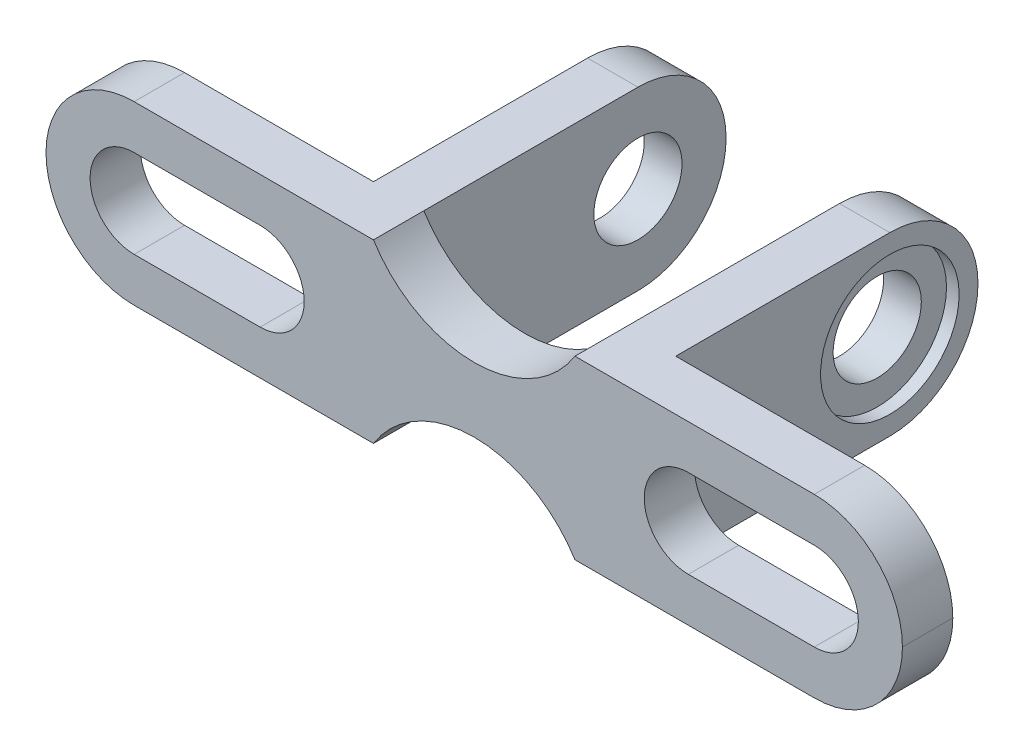
ISO-10303-21;
HEADER;
FILE_DESCRIPTION(('STEP AP214'),'2;1');
FILE_NAME('part.step','',(''),(''),'','','');
FILE_SCHEMA(('AUTOMOTIVE_DESIGN { 1 0 10303 214 1 1 1 1 }'));
ENDSEC;
DATA;
#1=APPLICATION_CONTEXT('core data for automotive mechanical design processes');
#2=APPLICATION_PROTOCOL_DEFINITION('international standard','automotive_design',2000,#1);
#3=PRODUCT_CONTEXT('',#1,'mechanical');
#4=PRODUCT('Part','Part','',(#3));
#5=PRODUCT_RELATED_PRODUCT_CATEGORY('part','',(#4));
#6=PRODUCT_DEFINITION_FORMATION('','',#4);
#7=PRODUCT_DEFINITION_CONTEXT('part definition',#1,'design');
#8=PRODUCT_DEFINITION('design','',#6,#7);
#9=PRODUCT_DEFINITION_SHAPE('','',#8);
#10=(LENGTH_UNIT() NAMED_UNIT(*) SI_UNIT(.MILLI.,.METRE.));
#11=(NAMED_UNIT(*) PLANE_ANGLE_UNIT() SI_UNIT($,.RADIAN.));
#12=(NAMED_UNIT(*) SI_UNIT($,.STERADIAN.) SOLID_ANGLE_UNIT());
#13=UNCERTAINTY_MEASURE_WITH_UNIT(LENGTH_MEASURE(1.E-05),#10,'distance_accuracy_value','');
#14=(GEOMETRIC_REPRESENTATION_CONTEXT(3) GLOBAL_UNCERTAINTY_ASSIGNED_CONTEXT((#13)) GLOBAL_UNIT_ASSIGNED_CONTEXT((#10,
#11,#12)) REPRESENTATION_CONTEXT('',''));
#15=CARTESIAN_POINT('',(0.,0.,0.));
#16=DIRECTION('',(0.,0.,1.));
#17=DIRECTION('',(1.,0.,0.));
#18=AXIS2_PLACEMENT_3D('',#15,#16,#17);
#19=CARTESIAN_POINT('',(-17.,0.,-8.5));
#20=DIRECTION('',(1.,0.,0.));
#21=DIRECTION('',(0.,0.,-1.));
#22=AXIS2_PLACEMENT_3D('',#19,#20,#21);
#23=CYLINDRICAL_SURFACE('',#22,1.75);
#24=CARTESIAN_POINT('',(-4.,0.,-8.5));
#25=DIRECTION('',(-1.,0.,0.));
#26=DIRECTION('',(0.,-1.,0.));
#27=AXIS2_PLACEMENT_3D('',#24,#25,#26);
#28=CIRCLE('',#27,1.75);
#29=CARTESIAN_POINT('',(-4.,-1.75,-8.5));
#30=VERTEX_POINT('',#29);
#31=EDGE_CURVE('E348',#30,#30,#28,.T.);
#32=ORIENTED_EDGE('',*,*,#31,.F.);
#33=EDGE_LOOP('',(#32));
#34=FACE_BOUND('',#33,.T.);
#35=CARTESIAN_POINT('',(-5.5,0.,-8.5));
#36=DIRECTION('',(-1.,0.,0.));
#37=DIRECTION('',(0.,-1.,0.));
#38=AXIS2_PLACEMENT_3D('',#35,#36,#37);
#39=CIRCLE('',#38,1.75);
#40=CARTESIAN_POINT('',(-5.5,-1.75,-8.5));
#41=VERTEX_POINT('',#40);
#42=EDGE_CURVE('E41',#41,#41,#39,.F.);
#43=ORIENTED_EDGE('',*,*,#42,.F.);
#44=EDGE_LOOP('',(#43));
#45=FACE_BOUND('',#44,.T.);
#46=ADVANCED_FACE('F37',(#34,#45),#23,.F.);
#47=CARTESIAN_POINT('',(4.,0.,-8.5));
#48=DIRECTION('',(1.,0.,0.));
#49=DIRECTION('',(0.,1.,0.));
#50=AXIS2_PLACEMENT_3D('',#47,#48,#49);
#51=CIRCLE('',#50,1.75);
#52=CARTESIAN_POINT('',(4.,1.75,-8.5));
#53=VERTEX_POINT('',#52);
#54=EDGE_CURVE('E394',#53,#53,#51,.T.);
#55=ORIENTED_EDGE('',*,*,#54,.F.);
#56=EDGE_LOOP('',(#55));
#57=FACE_BOUND('',#56,.T.);
#58=CARTESIAN_POINT('',(5.5,0.,-8.5));
#59=DIRECTION('',(1.,0.,0.));
#60=DIRECTION('',(0.,0.,-1.));
#61=AXIS2_PLACEMENT_3D('',#58,#59,#60);
#62=CIRCLE('',#61,1.75);
#63=CARTESIAN_POINT('',(5.5,0.,-10.25));
#64=VERTEX_POINT('',#63);
#65=EDGE_CURVE('E378',#64,#64,#62,.F.);
#66=ORIENTED_EDGE('',*,*,#65,.F.);
#67=EDGE_LOOP('',(#66));
#68=FACE_BOUND('',#67,.T.);
#69=ADVANCED_FACE('F527',(#57,#68),#23,.F.);
#70=CARTESIAN_POINT('',(0.,-6.,0.));
#71=DIRECTION('',(0.,0.,-1.));
#72=DIRECTION('',(-1.,0.,0.));
#73=AXIS2_PLACEMENT_3D('',#70,#71,#72);
#74=PLANE('',#73);
#75=DIRECTION('',(-1.,0.,0.));
#76=VECTOR('',#75,1.);
#77=CARTESIAN_POINT('',(-13.5,1.75,0.));
#78=LINE('',#77,#76);
#79=CARTESIAN_POINT('',(-8.5,1.75,0.));
#80=VERTEX_POINT('',#79);
#81=CARTESIAN_POINT('',(-13.5,1.75,0.));
#82=VERTEX_POINT('',#81);
#83=EDGE_CURVE('E305',#80,#82,#78,.T.);
#84=ORIENTED_EDGE('',*,*,#83,.T.);
#85=CARTESIAN_POINT('',(-13.5,0.,0.));
#86=DIRECTION('',(0.,0.,1.));
#87=DIRECTION('',(1.,0.,0.));
#88=AXIS2_PLACEMENT_3D('',#85,#86,#87);
#89=CIRCLE('',#88,1.75);
#90=CARTESIAN_POINT('',(-13.5,-1.75000000000001,0.));
#91=VERTEX_POINT('',#90);
#92=EDGE_CURVE('E301',#82,#91,#89,.T.);
#93=ORIENTED_EDGE('',*,*,#92,.T.);
#94=DIRECTION('',(1.,0.,0.));
#95=VECTOR('',#94,1.);
#96=CARTESIAN_POINT('',(-13.5,-1.75000000000001,0.));
#97=LINE('',#96,#95);
#98=CARTESIAN_POINT('',(-8.5,-1.75,0.));
#99=VERTEX_POINT('',#98);
#100=EDGE_CURVE('E315',#91,#99,#97,.T.);
#101=ORIENTED_EDGE('',*,*,#100,.T.);
#102=CARTESIAN_POINT('',(-8.5,0.,0.));
#103=DIRECTION('',(0.,0.,1.));
#104=DIRECTION('',(1.,0.,0.));
#105=AXIS2_PLACEMENT_3D('',#102,#103,#104);
#106=CIRCLE('',#105,1.75);
#107=EDGE_CURVE('E318',#99,#80,#106,.T.);
#108=ORIENTED_EDGE('',*,*,#107,.T.);
#109=EDGE_LOOP('',(#84,#93,#101,#108));
#110=FACE_BOUND('',#109,.T.);
#111=DIRECTION('',(1.,0.,0.));
#112=VECTOR('',#111,1.);
#113=CARTESIAN_POINT('',(-17.,-3.5,0.));
#114=LINE('',#113,#112);
#115=CARTESIAN_POINT('',(-13.5,-3.5,0.));
#116=VERTEX_POINT('',#115);
#117=CARTESIAN_POINT('',(-6.,-3.5,0.));
#118=VERTEX_POINT('',#117);
#119=EDGE_CURVE('E231',#116,#118,#114,.T.);
#120=ORIENTED_EDGE('',*,*,#119,.F.);
#121=CARTESIAN_POINT('',(-13.5,0.,0.));
#122=DIRECTION('',(0.,0.,-1.));
#123=DIRECTION('',(-1.,0.,0.));
#124=AXIS2_PLACEMENT_3D('',#121,#122,#123);
#125=CIRCLE('',#124,3.5);
#126=CARTESIAN_POINT('',(-17.,0.,0.));
#127=VERTEX_POINT('',#126);
#128=EDGE_CURVE('E46',#116,#127,#125,.T.);
#129=ORIENTED_EDGE('',*,*,#128,.T.);
#130=CARTESIAN_POINT('',(-13.5,0.,0.));
#131=DIRECTION('',(0.,0.,-1.));
#132=DIRECTION('',(-1.,0.,0.));
#133=AXIS2_PLACEMENT_3D('',#130,#131,#132);
#134=CIRCLE('',#133,3.5);
#135=CARTESIAN_POINT('',(-13.5,3.5,0.));
#136=VERTEX_POINT('',#135);
#137=EDGE_CURVE('E57',#127,#136,#134,.T.);
#138=ORIENTED_EDGE('',*,*,#137,.T.);
#139=DIRECTION('',(-1.,0.,0.));
#140=VECTOR('',#139,1.);
#141=CARTESIAN_POINT('',(-17.,3.5,0.));
#142=LINE('',#141,#140);
#143=CARTESIAN_POINT('',(-6.,3.5,0.));
#144=VERTEX_POINT('',#143);
#145=EDGE_CURVE('E211',#144,#136,#142,.T.);
#146=ORIENTED_EDGE('',*,*,#145,.F.);
#147=DIRECTION('',(0.,1.,0.));
#148=VECTOR('',#147,1.);
#149=CARTESIAN_POINT('',(-6.,3.5,0.));
#150=LINE('',#149,#148);
#151=EDGE_CURVE('E223',#118,#144,#150,.T.);
#152=ORIENTED_EDGE('',*,*,#151,.F.);
#153=EDGE_LOOP('',(#120,#129,#138,#146,#152));
#154=FACE_BOUND('',#153,.T.);
#155=ADVANCED_FACE('F230',(#110,#154),#74,.T.);
#156=CARTESIAN_POINT('',(0.,-6.,0.));
#157=DIRECTION('',(0.,0.,-1.));
#158=DIRECTION('',(-1.,0.,0.));
#159=AXIS2_PLACEMENT_3D('',#156,#157,#158);
#160=CIRCLE('',#159,4.7169905660283);
#161=CARTESIAN_POINT('',(-3.99999999999999,-3.5,0.));
#162=VERTEX_POINT('',#161);
#163=CARTESIAN_POINT('',(3.99999999999999,-3.5,0.));
#164=VERTEX_POINT('',#163);
#165=EDGE_CURVE('E234',#162,#164,#160,.T.);
#166=ORIENTED_EDGE('',*,*,#165,.F.);
#167=DIRECTION('',(0.,-1.,0.));
#168=VECTOR('',#167,1.);
#169=CARTESIAN_POINT('',(-4.,3.5,0.));
#170=LINE('',#169,#168);
#171=CARTESIAN_POINT('',(-4.,3.5,0.));
#172=VERTEX_POINT('',#171);
#173=EDGE_CURVE('E227',#172,#162,#170,.T.);
#174=ORIENTED_EDGE('',*,*,#173,.F.);
#175=CARTESIAN_POINT('',(0.,6.,0.));
#176=DIRECTION('',(0.,0.,-1.));
#177=DIRECTION('',(1.,0.,0.));
#178=AXIS2_PLACEMENT_3D('',#175,#176,#177);
#179=CIRCLE('',#178,4.7169905660283);
#180=CARTESIAN_POINT('',(4.,3.5,0.));
#181=VERTEX_POINT('',#180);
#182=EDGE_CURVE('E232',#181,#172,#179,.T.);
#183=ORIENTED_EDGE('',*,*,#182,.F.);
#184=DIRECTION('',(0.,1.,0.));
#185=VECTOR('',#184,1.);
#186=CARTESIAN_POINT('',(4.,3.5,0.));
#187=LINE('',#186,#185);
#188=EDGE_CURVE('E218',#164,#181,#187,.T.);
#189=ORIENTED_EDGE('',*,*,#188,.F.);
#190=EDGE_LOOP('',(#166,#174,#183,#189));
#191=FACE_BOUND('',#190,.T.);
#192=ADVANCED_FACE('F414',(#191),#74,.T.);
#193=CARTESIAN_POINT('',(0.,-6.,2.));
#194=DIRECTION('',(0.,0.,-1.));
#195=DIRECTION('',(-1.,0.,0.));
#196=AXIS2_PLACEMENT_3D('',#193,#194,#195);
#197=PLANE('',#196);
#198=CARTESIAN_POINT('',(-13.5,0.,2.));
#199=DIRECTION('',(0.,0.,1.));
#200=DIRECTION('',(1.,0.,0.));
#201=AXIS2_PLACEMENT_3D('',#198,#199,#200);
#202=CIRCLE('',#201,1.75);
#203=CARTESIAN_POINT('',(-13.5,1.75,2.));
#204=VERTEX_POINT('',#203);
#205=CARTESIAN_POINT('',(-13.5,-1.75000000000001,2.));
#206=VERTEX_POINT('',#205);
#207=EDGE_CURVE('E302',#204,#206,#202,.T.);
#208=ORIENTED_EDGE('',*,*,#207,.F.);
#209=DIRECTION('',(-1.,0.,0.));
#210=VECTOR('',#209,1.);
#211=CARTESIAN_POINT('',(-13.5,1.75,2.));
#212=LINE('',#211,#210);
#213=CARTESIAN_POINT('',(-8.5,1.75,2.));
#214=VERTEX_POINT('',#213);
#215=EDGE_CURVE('E310',#214,#204,#212,.T.);
#216=ORIENTED_EDGE('',*,*,#215,.F.);
#217=CARTESIAN_POINT('',(-8.5,0.,2.));
#218=DIRECTION('',(0.,0.,1.));
#219=DIRECTION('',(1.,0.,0.));
#220=AXIS2_PLACEMENT_3D('',#217,#218,#219);
#221=CIRCLE('',#220,1.75);
#222=CARTESIAN_POINT('',(-8.5,-1.75,2.));
#223=VERTEX_POINT('',#222);
#224=EDGE_CURVE('E307',#223,#214,#221,.T.);
#225=ORIENTED_EDGE('',*,*,#224,.F.);
#226=DIRECTION('',(1.,0.,0.));
#227=VECTOR('',#226,1.);
#228=CARTESIAN_POINT('',(-13.5,-1.75000000000001,2.));
#229=LINE('',#228,#227);
#230=EDGE_CURVE('E304',#206,#223,#229,.T.);
#231=ORIENTED_EDGE('',*,*,#230,.F.);
#232=EDGE_LOOP('',(#208,#216,#225,#231));
#233=FACE_BOUND('',#232,.T.);
#234=DIRECTION('',(1.,0.,0.));
#235=VECTOR('',#234,1.);
#236=CARTESIAN_POINT('',(3.99999999999999,-3.5,2.));
#237=LINE('',#236,#235);
#238=CARTESIAN_POINT('',(3.99999999999999,-3.5,2.));
#239=VERTEX_POINT('',#238);
#240=CARTESIAN_POINT('',(13.5,-3.5,2.));
#241=VERTEX_POINT('',#240);
#242=EDGE_CURVE('E342',#239,#241,#237,.T.);
#243=ORIENTED_EDGE('',*,*,#242,.T.);
#244=CARTESIAN_POINT('',(13.5,0.,2.));
#245=DIRECTION('',(0.,0.,-1.));
#246=DIRECTION('',(-1.,0.,0.));
#247=AXIS2_PLACEMENT_3D('',#244,#245,#246);
#248=CIRCLE('',#247,3.5);
#249=CARTESIAN_POINT('',(17.,0.,2.));
#250=VERTEX_POINT('',#249);
#251=EDGE_CURVE('E364',#241,#250,#248,.F.);
#252=ORIENTED_EDGE('',*,*,#251,.T.);
#253=CARTESIAN_POINT('',(13.5,0.,2.));
#254=DIRECTION('',(0.,0.,-1.));
#255=DIRECTION('',(-1.,0.,0.));
#256=AXIS2_PLACEMENT_3D('',#253,#254,#255);
#257=CIRCLE('',#256,3.5);
#258=CARTESIAN_POINT('',(13.5,3.5,2.));
#259=VERTEX_POINT('',#258);
#260=EDGE_CURVE('E362',#250,#259,#257,.F.);
#261=ORIENTED_EDGE('',*,*,#260,.T.);
#262=DIRECTION('',(-1.,0.,0.));
#263=VECTOR('',#262,1.);
#264=CARTESIAN_POINT('',(4.,3.5,2.));
#265=LINE('',#264,#263);
#266=CARTESIAN_POINT('',(4.,3.5,2.));
#267=VERTEX_POINT('',#266);
#268=EDGE_CURVE('E252',#259,#267,#265,.T.);
#269=ORIENTED_EDGE('',*,*,#268,.T.);
#270=CARTESIAN_POINT('',(0.,6.,2.));
#271=DIRECTION('',(0.,0.,-1.));
#272=DIRECTION('',(1.,0.,0.));
#273=AXIS2_PLACEMENT_3D('',#270,#271,#272);
#274=CIRCLE('',#273,4.7169905660283);
#275=CARTESIAN_POINT('',(-4.,3.5,2.));
#276=VERTEX_POINT('',#275);
#277=EDGE_CURVE('E333',#267,#276,#274,.T.);
#278=ORIENTED_EDGE('',*,*,#277,.T.);
#279=DIRECTION('',(-1.,0.,0.));
#280=VECTOR('',#279,1.);
#281=CARTESIAN_POINT('',(-17.,3.5,2.));
#282=LINE('',#281,#280);
#283=CARTESIAN_POINT('',(-13.5,3.5,2.));
#284=VERTEX_POINT('',#283);
#285=EDGE_CURVE('E335',#276,#284,#282,.T.);
#286=ORIENTED_EDGE('',*,*,#285,.T.);
#287=CARTESIAN_POINT('',(-13.5,0.,2.));
#288=DIRECTION('',(0.,0.,-1.));
#289=DIRECTION('',(-1.,0.,0.));
#290=AXIS2_PLACEMENT_3D('',#287,#288,#289);
#291=CIRCLE('',#290,3.5);
#292=CARTESIAN_POINT('',(-17.,0.,2.));
#293=VERTEX_POINT('',#292);
#294=EDGE_CURVE('E358',#284,#293,#291,.F.);
#295=ORIENTED_EDGE('',*,*,#294,.T.);
#296=CARTESIAN_POINT('',(-13.5,0.,2.));
#297=DIRECTION('',(0.,0.,-1.));
#298=DIRECTION('',(-1.,0.,0.));
#299=AXIS2_PLACEMENT_3D('',#296,#297,#298);
#300=CIRCLE('',#299,3.5);
#301=CARTESIAN_POINT('',(-13.5,-3.5,2.));
#302=VERTEX_POINT('',#301);
#303=EDGE_CURVE('E360',#293,#302,#300,.F.);
#304=ORIENTED_EDGE('',*,*,#303,.T.);
#305=DIRECTION('',(1.,0.,0.));
#306=VECTOR('',#305,1.);
#307=CARTESIAN_POINT('',(-17.,-3.5,2.));
#308=LINE('',#307,#306);
#309=CARTESIAN_POINT('',(-3.99999999999999,-3.5,2.));
#310=VERTEX_POINT('',#309);
#311=EDGE_CURVE('E338',#302,#310,#308,.T.);
#312=ORIENTED_EDGE('',*,*,#311,.T.);
#313=CARTESIAN_POINT('',(0.,-6.,2.));
#314=DIRECTION('',(0.,0.,-1.));
#315=DIRECTION('',(-1.,0.,0.));
#316=AXIS2_PLACEMENT_3D('',#313,#314,#315);
#317=CIRCLE('',#316,4.7169905660283);
#318=EDGE_CURVE('E340',#310,#239,#317,.T.);
#319=ORIENTED_EDGE('',*,*,#318,.T.);
#320=EDGE_LOOP('',(#243,#252,#261,#269,#278,#286,#295,#304,#312,#319));
#321=FACE_BOUND('',#320,.T.);
#322=CARTESIAN_POINT('',(13.5,0.,2.));
#323=DIRECTION('',(0.,0.,1.));
#324=DIRECTION('',(-1.,0.,0.));
#325=AXIS2_PLACEMENT_3D('',#322,#323,#324);
#326=CIRCLE('',#325,1.75);
#327=CARTESIAN_POINT('',(13.5,-1.75,2.));
#328=VERTEX_POINT('',#327);
#329=CARTESIAN_POINT('',(13.5,1.75,2.));
#330=VERTEX_POINT('',#329);
#331=EDGE_CURVE('E271',#328,#330,#326,.T.);
#332=ORIENTED_EDGE('',*,*,#331,.F.);
#333=DIRECTION('',(1.,0.,0.));
#334=VECTOR('',#333,1.);
#335=CARTESIAN_POINT('',(13.5,-1.75,2.));
#336=LINE('',#335,#334);
#337=CARTESIAN_POINT('',(8.5,-1.75,2.));
#338=VERTEX_POINT('',#337);
#339=EDGE_CURVE('E279',#338,#328,#336,.T.);
#340=ORIENTED_EDGE('',*,*,#339,.F.);
#341=CARTESIAN_POINT('',(8.5,0.,2.));
#342=DIRECTION('',(0.,0.,1.));
#343=DIRECTION('',(-1.,0.,0.));
#344=AXIS2_PLACEMENT_3D('',#341,#342,#343);
#345=CIRCLE('',#344,1.75);
#346=CARTESIAN_POINT('',(8.5,1.75,2.));
#347=VERTEX_POINT('',#346);
#348=EDGE_CURVE('E276',#347,#338,#345,.T.);
#349=ORIENTED_EDGE('',*,*,#348,.F.);
#350=DIRECTION('',(-1.,0.,0.));
#351=VECTOR('',#350,1.);
#352=CARTESIAN_POINT('',(13.5,1.75,2.));
#353=LINE('',#352,#351);
#354=EDGE_CURVE('E273',#330,#347,#353,.T.);
#355=ORIENTED_EDGE('',*,*,#354,.F.);
#356=EDGE_LOOP('',(#332,#340,#349,#355));
#357=FACE_BOUND('',#356,.T.);
#358=ADVANCED_FACE('F440',(#233,#321,#357),#197,.F.);
#359=CARTESIAN_POINT('',(13.5,0.,0.));
#360=DIRECTION('',(0.,0.,-1.));
#361=DIRECTION('',(-1.,0.,0.));
#362=AXIS2_PLACEMENT_3D('',#359,#360,#361);
#363=CIRCLE('',#362,3.5);
#364=CARTESIAN_POINT('',(13.5,3.5,0.));
#365=VERTEX_POINT('',#364);
#366=CARTESIAN_POINT('',(17.,0.,0.));
#367=VERTEX_POINT('',#366);
#368=EDGE_CURVE('E350',#365,#367,#363,.T.);
#369=ORIENTED_EDGE('',*,*,#368,.T.);
#370=CARTESIAN_POINT('',(13.5,0.,0.));
#371=DIRECTION('',(0.,0.,-1.));
#372=DIRECTION('',(-1.,0.,0.));
#373=AXIS2_PLACEMENT_3D('',#370,#371,#372);
#374=CIRCLE('',#373,3.5);
#375=CARTESIAN_POINT('',(13.5,-3.5,0.));
#376=VERTEX_POINT('',#375);
#377=EDGE_CURVE('E352',#367,#376,#374,.T.);
#378=ORIENTED_EDGE('',*,*,#377,.T.);
#379=DIRECTION('',(1.,0.,0.));
#380=VECTOR('',#379,1.);
#381=CARTESIAN_POINT('',(3.99999999999999,-3.5,0.));
#382=LINE('',#381,#380);
#383=CARTESIAN_POINT('',(6.,-3.5,0.));
#384=VERTEX_POINT('',#383);
#385=EDGE_CURVE('E243',#384,#376,#382,.T.);
#386=ORIENTED_EDGE('',*,*,#385,.F.);
#387=DIRECTION('',(0.,-1.,0.));
#388=VECTOR('',#387,1.);
#389=CARTESIAN_POINT('',(6.,3.5,0.));
#390=LINE('',#389,#388);
#391=CARTESIAN_POINT('',(6.,3.5,0.));
#392=VERTEX_POINT('',#391);
#393=EDGE_CURVE('E255',#392,#384,#390,.T.);
#394=ORIENTED_EDGE('',*,*,#393,.F.);
#395=DIRECTION('',(-1.,0.,0.));
#396=VECTOR('',#395,1.);
#397=CARTESIAN_POINT('',(4.,3.5,0.));
#398=LINE('',#397,#396);
#399=EDGE_CURVE('E237',#365,#392,#398,.T.);
#400=ORIENTED_EDGE('',*,*,#399,.F.);
#401=EDGE_LOOP('',(#369,#378,#386,#394,#400));
#402=FACE_BOUND('',#401,.T.);
#403=DIRECTION('',(1.,0.,0.));
#404=VECTOR('',#403,1.);
#405=CARTESIAN_POINT('',(13.5,-1.75,0.));
#406=LINE('',#405,#404);
#407=CARTESIAN_POINT('',(8.5,-1.75,0.));
#408=VERTEX_POINT('',#407);
#409=CARTESIAN_POINT('',(13.5,-1.75,0.));
#410=VERTEX_POINT('',#409);
#411=EDGE_CURVE('E274',#408,#410,#406,.T.);
#412=ORIENTED_EDGE('',*,*,#411,.T.);
#413=CARTESIAN_POINT('',(13.5,0.,0.));
#414=DIRECTION('',(0.,0.,1.));
#415=DIRECTION('',(-1.,0.,0.));
#416=AXIS2_PLACEMENT_3D('',#413,#414,#415);
#417=CIRCLE('',#416,1.75);
#418=CARTESIAN_POINT('',(13.5,1.75,0.));
#419=VERTEX_POINT('',#418);
#420=EDGE_CURVE('E269',#410,#419,#417,.T.);
#421=ORIENTED_EDGE('',*,*,#420,.T.);
#422=DIRECTION('',(-1.,0.,0.));
#423=VECTOR('',#422,1.);
#424=CARTESIAN_POINT('',(13.5,1.75,0.));
#425=LINE('',#424,#423);
#426=CARTESIAN_POINT('',(8.5,1.75,0.));
#427=VERTEX_POINT('',#426);
#428=EDGE_CURVE('E284',#419,#427,#425,.T.);
#429=ORIENTED_EDGE('',*,*,#428,.T.);
#430=CARTESIAN_POINT('',(8.5,0.,0.));
#431=DIRECTION('',(0.,0.,1.));
#432=DIRECTION('',(-1.,0.,0.));
#433=AXIS2_PLACEMENT_3D('',#430,#431,#432);
#434=CIRCLE('',#433,1.75);
#435=EDGE_CURVE('E287',#427,#408,#434,.T.);
#436=ORIENTED_EDGE('',*,*,#435,.T.);
#437=EDGE_LOOP('',(#412,#421,#429,#436));
#438=FACE_BOUND('',#437,.T.);
#439=ADVANCED_FACE('F488',(#402,#438),#74,.T.);
#440=CARTESIAN_POINT('',(4.,3.5,2.));
#441=DIRECTION('',(0.,-1.,0.));
#442=DIRECTION('',(1.,0.,0.));
#443=AXIS2_PLACEMENT_3D('',#440,#441,#442);
#444=PLANE('',#443);
#445=ORIENTED_EDGE('',*,*,#268,.F.);
#446=DIRECTION('',(0.,0.,-1.));
#447=VECTOR('',#446,1.);
#448=CARTESIAN_POINT('',(13.5,3.5,2.));
#449=LINE('',#448,#447);
#450=EDGE_CURVE('E366',#259,#365,#449,.T.);
#451=ORIENTED_EDGE('',*,*,#450,.T.);
#452=ORIENTED_EDGE('',*,*,#399,.T.);
#453=DIRECTION('',(0.,0.,1.));
#454=VECTOR('',#453,1.);
#455=CARTESIAN_POINT('',(6.,3.5,-12.));
#456=LINE('',#455,#454);
#457=CARTESIAN_POINT('',(6.,3.5,-8.5));
#458=VERTEX_POINT('',#457);
#459=EDGE_CURVE('E270',#458,#392,#456,.T.);
#460=ORIENTED_EDGE('',*,*,#459,.F.);
#461=DIRECTION('',(1.,0.,0.));
#462=VECTOR('',#461,1.);
#463=CARTESIAN_POINT('',(4.,3.5,-8.5));
#464=LINE('',#463,#462);
#465=CARTESIAN_POINT('',(4.,3.5,-8.5));
#466=VERTEX_POINT('',#465);
#467=EDGE_CURVE('E353',#458,#466,#464,.F.);
#468=ORIENTED_EDGE('',*,*,#467,.T.);
#469=DIRECTION('',(0.,0.,1.));
#470=VECTOR('',#469,1.);
#471=CARTESIAN_POINT('',(4.,3.5,-12.));
#472=LINE('',#471,#470);
#473=EDGE_CURVE('E267',#466,#181,#472,.T.);
#474=ORIENTED_EDGE('',*,*,#473,.T.);
#475=DIRECTION('',(0.,0.,-1.));
#476=VECTOR('',#475,1.);
#477=CARTESIAN_POINT('',(4.,3.5,2.));
#478=LINE('',#477,#476);
#479=EDGE_CURVE('E253',#267,#181,#478,.T.);
#480=ORIENTED_EDGE('',*,*,#479,.F.);
#481=EDGE_LOOP('',(#445,#451,#452,#460,#468,#474,#480));
#482=FACE_BOUND('',#481,.T.);
#483=ADVANCED_FACE('F498',(#482),#444,.F.);
#484=CARTESIAN_POINT('',(0.,6.,2.));
#485=DIRECTION('',(0.,0.,-1.));
#486=DIRECTION('',(-1.,0.,0.));
#487=AXIS2_PLACEMENT_3D('',#484,#485,#486);
#488=CYLINDRICAL_SURFACE('',#487,4.7169905660283);
#489=ORIENTED_EDGE('',*,*,#182,.T.);
#490=DIRECTION('',(0.,0.,-1.));
#491=VECTOR('',#490,1.);
#492=CARTESIAN_POINT('',(-4.,3.5,2.));
#493=LINE('',#492,#491);
#494=EDGE_CURVE('E421',#276,#172,#493,.T.);
#495=ORIENTED_EDGE('',*,*,#494,.F.);
#496=ORIENTED_EDGE('',*,*,#277,.F.);
#497=ORIENTED_EDGE('',*,*,#479,.T.);
#498=EDGE_LOOP('',(#489,#495,#496,#497));
#499=FACE_BOUND('',#498,.T.);
#500=ADVANCED_FACE('F419',(#499),#488,.F.);
#501=CARTESIAN_POINT('',(-17.,3.5,2.));
#502=DIRECTION('',(0.,-1.,0.));
#503=DIRECTION('',(0.,0.,-1.));
#504=AXIS2_PLACEMENT_3D('',#501,#502,#503);
#505=PLANE('',#504);
#506=ORIENTED_EDGE('',*,*,#145,.T.);
#507=DIRECTION('',(0.,0.,-1.));
#508=VECTOR('',#507,1.);
#509=CARTESIAN_POINT('',(-13.5,3.5,2.));
#510=LINE('',#509,#508);
#511=EDGE_CURVE('E11',#136,#284,#510,.F.);
#512=ORIENTED_EDGE('',*,*,#511,.T.);
#513=ORIENTED_EDGE('',*,*,#285,.F.);
#514=ORIENTED_EDGE('',*,*,#494,.T.);
#515=DIRECTION('',(0.,0.,1.));
#516=VECTOR('',#515,1.);
#517=CARTESIAN_POINT('',(-4.,3.5,-12.));
#518=LINE('',#517,#516);
#519=CARTESIAN_POINT('',(-4.,3.5,-8.5));
#520=VERTEX_POINT('',#519);
#521=EDGE_CURVE('E219',#520,#172,#518,.T.);
#522=ORIENTED_EDGE('',*,*,#521,.F.);
#523=DIRECTION('',(1.,0.,0.));
#524=VECTOR('',#523,1.);
#525=CARTESIAN_POINT('',(-17.,3.5,-8.5));
#526=LINE('',#525,#524);
#527=CARTESIAN_POINT('',(-6.,3.5,-8.5));
#528=VERTEX_POINT('',#527);
#529=EDGE_CURVE('E215',#520,#528,#526,.F.);
#530=ORIENTED_EDGE('',*,*,#529,.T.);
#531=DIRECTION('',(0.,0.,1.));
#532=VECTOR('',#531,1.);
#533=CARTESIAN_POINT('',(-6.,3.5,-12.));
#534=LINE('',#533,#532);
#535=EDGE_CURVE('E208',#528,#144,#534,.T.);
#536=ORIENTED_EDGE('',*,*,#535,.T.);
#537=EDGE_LOOP('',(#506,#512,#513,#514,#522,#530,#536));
#538=FACE_BOUND('',#537,.T.);
#539=ADVANCED_FACE('F210',(#538),#505,.F.);
#540=CARTESIAN_POINT('',(-17.,-3.5,2.));
#541=DIRECTION('',(0.,1.,0.));
#542=DIRECTION('',(0.,0.,1.));
#543=AXIS2_PLACEMENT_3D('',#540,#541,#542);
#544=PLANE('',#543);
#545=ORIENTED_EDGE('',*,*,#311,.F.);
#546=DIRECTION('',(0.,0.,-1.));
#547=VECTOR('',#546,1.);
#548=CARTESIAN_POINT('',(-13.5,-3.5,2.));
#549=LINE('',#548,#547);
#550=EDGE_CURVE('E368',#302,#116,#549,.T.);
#551=ORIENTED_EDGE('',*,*,#550,.T.);
#552=ORIENTED_EDGE('',*,*,#119,.T.);
#553=DIRECTION('',(0.,0.,1.));
#554=VECTOR('',#553,1.);
#555=CARTESIAN_POINT('',(-6.,-3.5,-12.));
#556=LINE('',#555,#554);
#557=CARTESIAN_POINT('',(-6.,-3.5,-8.5));
#558=VERTEX_POINT('',#557);
#559=EDGE_CURVE('E226',#558,#118,#556,.T.);
#560=ORIENTED_EDGE('',*,*,#559,.F.);
#561=DIRECTION('',(-1.,0.,0.));
#562=VECTOR('',#561,1.);
#563=CARTESIAN_POINT('',(-17.,-3.5,-8.5));
#564=LINE('',#563,#562);
#565=CARTESIAN_POINT('',(-4.,-3.5,-8.5));
#566=VERTEX_POINT('',#565);
#567=EDGE_CURVE('E449',#558,#566,#564,.F.);
#568=ORIENTED_EDGE('',*,*,#567,.T.);
#569=DIRECTION('',(0.,0.,1.));
#570=VECTOR('',#569,1.);
#571=CARTESIAN_POINT('',(-4.,-3.5,-12.));
#572=LINE('',#571,#570);
#573=EDGE_CURVE('E401',#566,#162,#572,.T.);
#574=ORIENTED_EDGE('',*,*,#573,.T.);
#575=DIRECTION('',(0.,0.,-1.));
#576=VECTOR('',#575,1.);
#577=CARTESIAN_POINT('',(-3.99999999999999,-3.5,2.));
#578=LINE('',#577,#576);
#579=EDGE_CURVE('E425',#310,#162,#578,.T.);
#580=ORIENTED_EDGE('',*,*,#579,.F.);
#581=EDGE_LOOP('',(#545,#551,#552,#560,#568,#574,#580));
#582=FACE_BOUND('',#581,.T.);
#583=ADVANCED_FACE('F446',(#582),#544,.F.);
#584=CARTESIAN_POINT('',(0.,-6.,2.));
#585=DIRECTION('',(0.,0.,-1.));
#586=DIRECTION('',(-1.,0.,0.));
#587=AXIS2_PLACEMENT_3D('',#584,#585,#586);
#588=CYLINDRICAL_SURFACE('',#587,4.7169905660283);
#589=ORIENTED_EDGE('',*,*,#165,.T.);
#590=DIRECTION('',(0.,0.,-1.));
#591=VECTOR('',#590,1.);
#592=CARTESIAN_POINT('',(3.99999999999999,-3.5,2.));
#593=LINE('',#592,#591);
#594=EDGE_CURVE('E246',#239,#164,#593,.T.);
#595=ORIENTED_EDGE('',*,*,#594,.F.);
#596=ORIENTED_EDGE('',*,*,#318,.F.);
#597=ORIENTED_EDGE('',*,*,#579,.T.);
#598=EDGE_LOOP('',(#589,#595,#596,#597));
#599=FACE_BOUND('',#598,.T.);
#600=ADVANCED_FACE('F438',(#599),#588,.F.);
#601=CARTESIAN_POINT('',(3.99999999999999,-3.5,2.));
#602=DIRECTION('',(0.,1.,0.));
#603=DIRECTION('',(-1.,0.,0.));
#604=AXIS2_PLACEMENT_3D('',#601,#602,#603);
#605=PLANE('',#604);
#606=ORIENTED_EDGE('',*,*,#385,.T.);
#607=DIRECTION('',(0.,0.,-1.));
#608=VECTOR('',#607,1.);
#609=CARTESIAN_POINT('',(13.5,-3.5,2.));
#610=LINE('',#609,#608);
#611=EDGE_CURVE('E355',#376,#241,#610,.F.);
#612=ORIENTED_EDGE('',*,*,#611,.T.);
#613=ORIENTED_EDGE('',*,*,#242,.F.);
#614=ORIENTED_EDGE('',*,*,#594,.T.);
#615=DIRECTION('',(0.,0.,1.));
#616=VECTOR('',#615,1.);
#617=CARTESIAN_POINT('',(4.,-3.5,-12.));
#618=LINE('',#617,#616);
#619=CARTESIAN_POINT('',(4.,-3.5,-8.5));
#620=VERTEX_POINT('',#619);
#621=EDGE_CURVE('E259',#620,#164,#618,.T.);
#622=ORIENTED_EDGE('',*,*,#621,.F.);
#623=DIRECTION('',(-1.,0.,0.));
#624=VECTOR('',#623,1.);
#625=CARTESIAN_POINT('',(6.,-3.5,-8.5));
#626=LINE('',#625,#624);
#627=CARTESIAN_POINT('',(6.,-3.5,-8.5));
#628=VERTEX_POINT('',#627);
#629=EDGE_CURVE('E469',#620,#628,#626,.F.);
#630=ORIENTED_EDGE('',*,*,#629,.T.);
#631=DIRECTION('',(0.,0.,1.));
#632=VECTOR('',#631,1.);
#633=CARTESIAN_POINT('',(6.,-3.5,-12.));
#634=LINE('',#633,#632);
#635=EDGE_CURVE('E266',#628,#384,#634,.T.);
#636=ORIENTED_EDGE('',*,*,#635,.T.);
#637=EDGE_LOOP('',(#606,#612,#613,#614,#622,#630,#636));
#638=FACE_BOUND('',#637,.T.);
#639=ADVANCED_FACE('F435',(#638),#605,.F.);
#640=CARTESIAN_POINT('',(-13.5,0.,2.));
#641=DIRECTION('',(0.,0.,-1.));
#642=DIRECTION('',(-1.,0.,0.));
#643=AXIS2_PLACEMENT_3D('',#640,#641,#642);
#644=CYLINDRICAL_SURFACE('',#643,1.75);
#645=ORIENTED_EDGE('',*,*,#92,.F.);
#646=DIRECTION('',(0.,0.,-1.));
#647=VECTOR('',#646,1.);
#648=CARTESIAN_POINT('',(-13.5,1.75,2.));
#649=LINE('',#648,#647);
#650=EDGE_CURVE('E312',#204,#82,#649,.T.);
#651=ORIENTED_EDGE('',*,*,#650,.F.);
#652=ORIENTED_EDGE('',*,*,#207,.T.);
#653=DIRECTION('',(0.,0.,-1.));
#654=VECTOR('',#653,1.);
#655=CARTESIAN_POINT('',(-13.5,-1.75000000000001,2.));
#656=LINE('',#655,#654);
#657=EDGE_CURVE('E329',#206,#91,#656,.T.);
#658=ORIENTED_EDGE('',*,*,#657,.T.);
#659=EDGE_LOOP('',(#645,#651,#652,#658));
#660=FACE_BOUND('',#659,.T.);
#661=ADVANCED_FACE('F579',(#660),#644,.F.);
#662=CARTESIAN_POINT('',(-13.5,-1.75000000000001,2.));
#663=DIRECTION('',(0.,1.,0.));
#664=DIRECTION('',(-1.,0.,0.));
#665=AXIS2_PLACEMENT_3D('',#662,#663,#664);
#666=PLANE('',#665);
#667=ORIENTED_EDGE('',*,*,#100,.F.);
#668=ORIENTED_EDGE('',*,*,#657,.F.);
#669=ORIENTED_EDGE('',*,*,#230,.T.);
#670=DIRECTION('',(0.,0.,-1.));
#671=VECTOR('',#670,1.);
#672=CARTESIAN_POINT('',(-8.5,-1.75,2.));
#673=LINE('',#672,#671);
#674=EDGE_CURVE('E327',#223,#99,#673,.T.);
#675=ORIENTED_EDGE('',*,*,#674,.T.);
#676=EDGE_LOOP('',(#667,#668,#669,#675));
#677=FACE_BOUND('',#676,.T.);
#678=ADVANCED_FACE('F575',(#677),#666,.T.);
#679=CARTESIAN_POINT('',(-8.5,0.,2.));
#680=DIRECTION('',(0.,0.,-1.));
#681=DIRECTION('',(-1.,0.,0.));
#682=AXIS2_PLACEMENT_3D('',#679,#680,#681);
#683=CYLINDRICAL_SURFACE('',#682,1.75);
#684=ORIENTED_EDGE('',*,*,#107,.F.);
#685=ORIENTED_EDGE('',*,*,#674,.F.);
#686=ORIENTED_EDGE('',*,*,#224,.T.);
#687=DIRECTION('',(0.,0.,-1.));
#688=VECTOR('',#687,1.);
#689=CARTESIAN_POINT('',(-8.5,1.75,2.));
#690=LINE('',#689,#688);
#691=EDGE_CURVE('E325',#214,#80,#690,.T.);
#692=ORIENTED_EDGE('',*,*,#691,.T.);
#693=EDGE_LOOP('',(#684,#685,#686,#692));
#694=FACE_BOUND('',#693,.T.);
#695=ADVANCED_FACE('F571',(#694),#683,.F.);
#696=CARTESIAN_POINT('',(-13.5,1.75,2.));
#697=DIRECTION('',(0.,-1.,0.));
#698=DIRECTION('',(1.,0.,0.));
#699=AXIS2_PLACEMENT_3D('',#696,#697,#698);
#700=PLANE('',#699);
#701=ORIENTED_EDGE('',*,*,#83,.F.);
#702=ORIENTED_EDGE('',*,*,#691,.F.);
#703=ORIENTED_EDGE('',*,*,#215,.T.);
#704=ORIENTED_EDGE('',*,*,#650,.T.);
#705=EDGE_LOOP('',(#701,#702,#703,#704));
#706=FACE_BOUND('',#705,.T.);
#707=ADVANCED_FACE('F567',(#706),#700,.T.);
#708=CARTESIAN_POINT('',(13.5,0.,2.));
#709=DIRECTION('',(0.,0.,-1.));
#710=DIRECTION('',(-1.,0.,0.));
#711=AXIS2_PLACEMENT_3D('',#708,#709,#710);
#712=CYLINDRICAL_SURFACE('',#711,1.75);
#713=ORIENTED_EDGE('',*,*,#420,.F.);
#714=DIRECTION('',(0.,0.,-1.));
#715=VECTOR('',#714,1.);
#716=CARTESIAN_POINT('',(13.5,-1.75,2.));
#717=LINE('',#716,#715);
#718=EDGE_CURVE('E281',#328,#410,#717,.T.);
#719=ORIENTED_EDGE('',*,*,#718,.F.);
#720=ORIENTED_EDGE('',*,*,#331,.T.);
#721=DIRECTION('',(0.,0.,-1.));
#722=VECTOR('',#721,1.);
#723=CARTESIAN_POINT('',(13.5,1.75,2.));
#724=LINE('',#723,#722);
#725=EDGE_CURVE('E298',#330,#419,#724,.T.);
#726=ORIENTED_EDGE('',*,*,#725,.T.);
#727=EDGE_LOOP('',(#713,#719,#720,#726));
#728=FACE_BOUND('',#727,.T.);
#729=ADVANCED_FACE('F563',(#728),#712,.F.);
#730=CARTESIAN_POINT('',(13.5,1.75,2.));
#731=DIRECTION('',(0.,-1.,0.));
#732=DIRECTION('',(1.,0.,0.));
#733=AXIS2_PLACEMENT_3D('',#730,#731,#732);
#734=PLANE('',#733);
#735=ORIENTED_EDGE('',*,*,#428,.F.);
#736=ORIENTED_EDGE('',*,*,#725,.F.);
#737=ORIENTED_EDGE('',*,*,#354,.T.);
#738=DIRECTION('',(0.,0.,-1.));
#739=VECTOR('',#738,1.);
#740=CARTESIAN_POINT('',(8.5,1.75,2.));
#741=LINE('',#740,#739);
#742=EDGE_CURVE('E296',#347,#427,#741,.T.);
#743=ORIENTED_EDGE('',*,*,#742,.T.);
#744=EDGE_LOOP('',(#735,#736,#737,#743));
#745=FACE_BOUND('',#744,.T.);
#746=ADVANCED_FACE('F559',(#745),#734,.T.);
#747=CARTESIAN_POINT('',(8.5,0.,2.));
#748=DIRECTION('',(0.,0.,-1.));
#749=DIRECTION('',(-1.,0.,0.));
#750=AXIS2_PLACEMENT_3D('',#747,#748,#749);
#751=CYLINDRICAL_SURFACE('',#750,1.75);
#752=ORIENTED_EDGE('',*,*,#435,.F.);
#753=ORIENTED_EDGE('',*,*,#742,.F.);
#754=ORIENTED_EDGE('',*,*,#348,.T.);
#755=DIRECTION('',(0.,0.,-1.));
#756=VECTOR('',#755,1.);
#757=CARTESIAN_POINT('',(8.5,-1.75,2.));
#758=LINE('',#757,#756);
#759=EDGE_CURVE('E294',#338,#408,#758,.T.);
#760=ORIENTED_EDGE('',*,*,#759,.T.);
#761=EDGE_LOOP('',(#752,#753,#754,#760));
#762=FACE_BOUND('',#761,.T.);
#763=ADVANCED_FACE('F555',(#762),#751,.F.);
#764=CARTESIAN_POINT('',(13.5,-1.75,2.));
#765=DIRECTION('',(0.,1.,0.));
#766=DIRECTION('',(-1.,0.,0.));
#767=AXIS2_PLACEMENT_3D('',#764,#765,#766);
#768=PLANE('',#767);
#769=ORIENTED_EDGE('',*,*,#411,.F.);
#770=ORIENTED_EDGE('',*,*,#759,.F.);
#771=ORIENTED_EDGE('',*,*,#339,.T.);
#772=ORIENTED_EDGE('',*,*,#718,.T.);
#773=EDGE_LOOP('',(#769,#770,#771,#772));
#774=FACE_BOUND('',#773,.T.);
#775=ADVANCED_FACE('F551',(#774),#768,.T.);
#776=CARTESIAN_POINT('',(4.,3.5,-12.));
#777=DIRECTION('',(1.,0.,0.));
#778=DIRECTION('',(0.,1.,0.));
#779=AXIS2_PLACEMENT_3D('',#776,#777,#778);
#780=PLANE('',#779);
#781=ORIENTED_EDGE('',*,*,#54,.T.);
#782=EDGE_LOOP('',(#781));
#783=FACE_BOUND('',#782,.T.);
#784=CARTESIAN_POINT('',(4.,0.,-8.5));
#785=DIRECTION('',(1.,0.,0.));
#786=DIRECTION('',(0.,1.,0.));
#787=AXIS2_PLACEMENT_3D('',#784,#785,#786);
#788=CIRCLE('',#787,3.5);
#789=CARTESIAN_POINT('',(4.,0.,-12.));
#790=VERTEX_POINT('',#789);
#791=EDGE_CURVE('E479',#466,#790,#788,.F.);
#792=ORIENTED_EDGE('',*,*,#791,.T.);
#793=CARTESIAN_POINT('',(4.,0.,-8.5));
#794=DIRECTION('',(1.,0.,0.));
#795=DIRECTION('',(0.,1.,0.));
#796=AXIS2_PLACEMENT_3D('',#793,#794,#795);
#797=CIRCLE('',#796,3.5);
#798=EDGE_CURVE('E481',#790,#620,#797,.F.);
#799=ORIENTED_EDGE('',*,*,#798,.T.);
#800=ORIENTED_EDGE('',*,*,#621,.T.);
#801=ORIENTED_EDGE('',*,*,#188,.T.);
#802=ORIENTED_EDGE('',*,*,#473,.F.);
#803=EDGE_LOOP('',(#792,#799,#800,#801,#802));
#804=FACE_BOUND('',#803,.T.);
#805=ADVANCED_FACE('F506',(#783,#804),#780,.F.);
#806=CARTESIAN_POINT('',(6.,3.5,-12.));
#807=DIRECTION('',(-1.,0.,0.));
#808=DIRECTION('',(0.,-1.,0.));
#809=AXIS2_PLACEMENT_3D('',#806,#807,#808);
#810=PLANE('',#809);
#811=CARTESIAN_POINT('',(6.,0.,-8.5));
#812=DIRECTION('',(1.,0.,0.));
#813=DIRECTION('',(0.,0.,-1.));
#814=AXIS2_PLACEMENT_3D('',#811,#812,#813);
#815=CIRCLE('',#814,2.75);
#816=CARTESIAN_POINT('',(6.,0.,-11.25));
#817=VERTEX_POINT('',#816);
#818=EDGE_CURVE('E384',#817,#817,#815,.T.);
#819=ORIENTED_EDGE('',*,*,#818,.F.);
#820=EDGE_LOOP('',(#819));
#821=FACE_BOUND('',#820,.T.);
#822=ORIENTED_EDGE('',*,*,#635,.F.);
#823=CARTESIAN_POINT('',(6.,0.,-8.5));
#824=DIRECTION('',(-1.,0.,0.));
#825=DIRECTION('',(0.,-1.,0.));
#826=AXIS2_PLACEMENT_3D('',#823,#824,#825);
#827=CIRCLE('',#826,3.5);
#828=CARTESIAN_POINT('',(6.,0.,-12.));
#829=VERTEX_POINT('',#828);
#830=EDGE_CURVE('E465',#628,#829,#827,.F.);
#831=ORIENTED_EDGE('',*,*,#830,.T.);
#832=CARTESIAN_POINT('',(6.,0.,-8.5));
#833=DIRECTION('',(-1.,0.,0.));
#834=DIRECTION('',(0.,-1.,0.));
#835=AXIS2_PLACEMENT_3D('',#832,#833,#834);
#836=CIRCLE('',#835,3.5);
#837=EDGE_CURVE('E467',#829,#458,#836,.F.);
#838=ORIENTED_EDGE('',*,*,#837,.T.);
#839=ORIENTED_EDGE('',*,*,#459,.T.);
#840=ORIENTED_EDGE('',*,*,#393,.T.);
#841=EDGE_LOOP('',(#822,#831,#838,#839,#840));
#842=FACE_BOUND('',#841,.T.);
#843=ADVANCED_FACE('F492',(#821,#842),#810,.F.);
#844=CARTESIAN_POINT('',(-6.,3.5,-12.));
#845=DIRECTION('',(1.,0.,0.));
#846=DIRECTION('',(0.,1.,0.));
#847=AXIS2_PLACEMENT_3D('',#844,#845,#846);
#848=PLANE('',#847);
#849=CARTESIAN_POINT('',(-6.,0.,-8.5));
#850=DIRECTION('',(-1.,0.,0.));
#851=DIRECTION('',(0.,-1.,0.));
#852=AXIS2_PLACEMENT_3D('',#849,#850,#851);
#853=CIRCLE('',#852,2.75);
#854=CARTESIAN_POINT('',(-6.,-2.75,-8.5));
#855=VERTEX_POINT('',#854);
#856=EDGE_CURVE('E391',#855,#855,#853,.T.);
#857=ORIENTED_EDGE('',*,*,#856,.F.);
#858=EDGE_LOOP('',(#857));
#859=FACE_BOUND('',#858,.T.);
#860=CARTESIAN_POINT('',(-6.,0.,-8.5));
#861=DIRECTION('',(1.,0.,0.));
#862=DIRECTION('',(0.,1.,0.));
#863=AXIS2_PLACEMENT_3D('',#860,#861,#862);
#864=CIRCLE('',#863,3.5);
#865=CARTESIAN_POINT('',(-6.,0.,-12.));
#866=VERTEX_POINT('',#865);
#867=EDGE_CURVE('E426',#528,#866,#864,.F.);
#868=ORIENTED_EDGE('',*,*,#867,.T.);
#869=CARTESIAN_POINT('',(-6.,0.,-8.5));
#870=DIRECTION('',(1.,0.,0.));
#871=DIRECTION('',(0.,1.,0.));
#872=AXIS2_PLACEMENT_3D('',#869,#870,#871);
#873=CIRCLE('',#872,3.5);
#874=EDGE_CURVE('E460',#866,#558,#873,.F.);
#875=ORIENTED_EDGE('',*,*,#874,.T.);
#876=ORIENTED_EDGE('',*,*,#559,.T.);
#877=ORIENTED_EDGE('',*,*,#151,.T.);
#878=ORIENTED_EDGE('',*,*,#535,.F.);
#879=EDGE_LOOP('',(#868,#875,#876,#877,#878));
#880=FACE_BOUND('',#879,.T.);
#881=ADVANCED_FACE('F224',(#859,#880),#848,.F.);
#882=CARTESIAN_POINT('',(-4.,3.5,-12.));
#883=DIRECTION('',(-1.,0.,0.));
#884=DIRECTION('',(0.,-1.,0.));
#885=AXIS2_PLACEMENT_3D('',#882,#883,#884);
#886=PLANE('',#885);
#887=ORIENTED_EDGE('',*,*,#31,.T.);
#888=EDGE_LOOP('',(#887));
#889=FACE_BOUND('',#888,.T.);
#890=ORIENTED_EDGE('',*,*,#573,.F.);
#891=CARTESIAN_POINT('',(-4.,0.,-8.5));
#892=DIRECTION('',(-1.,0.,0.));
#893=DIRECTION('',(0.,-1.,0.));
#894=AXIS2_PLACEMENT_3D('',#891,#892,#893);
#895=CIRCLE('',#894,3.5);
#896=CARTESIAN_POINT('',(-4.,0.,-12.));
#897=VERTEX_POINT('',#896);
#898=EDGE_CURVE('E450',#566,#897,#895,.F.);
#899=ORIENTED_EDGE('',*,*,#898,.T.);
#900=CARTESIAN_POINT('',(-4.,0.,-8.5));
#901=DIRECTION('',(-1.,0.,0.));
#902=DIRECTION('',(0.,-1.,0.));
#903=AXIS2_PLACEMENT_3D('',#900,#901,#902);
#904=CIRCLE('',#903,3.5);
#905=EDGE_CURVE('E409',#897,#520,#904,.F.);
#906=ORIENTED_EDGE('',*,*,#905,.T.);
#907=ORIENTED_EDGE('',*,*,#521,.T.);
#908=ORIENTED_EDGE('',*,*,#173,.T.);
#909=EDGE_LOOP('',(#890,#899,#906,#907,#908));
#910=FACE_BOUND('',#909,.T.);
#911=ADVANCED_FACE('F406',(#889,#910),#886,.F.);
#912=CARTESIAN_POINT('',(0.,0.,-8.5));
#913=DIRECTION('',(1.,0.,0.));
#914=DIRECTION('',(0.,0.,-1.));
#915=AXIS2_PLACEMENT_3D('',#912,#913,#914);
#916=CYLINDRICAL_SURFACE('',#915,3.5);
#917=ORIENTED_EDGE('',*,*,#529,.F.);
#918=ORIENTED_EDGE('',*,*,#905,.F.);
#919=DIRECTION('',(1.,0.,0.));
#920=VECTOR('',#919,1.);
#921=CARTESIAN_POINT('',(0.,0.,-12.));
#922=LINE('',#921,#920);
#923=EDGE_CURVE('E228',#866,#897,#922,.T.);
#924=ORIENTED_EDGE('',*,*,#923,.F.);
#925=ORIENTED_EDGE('',*,*,#867,.F.);
#926=EDGE_LOOP('',(#917,#918,#924,#925));
#927=FACE_BOUND('',#926,.T.);
#928=ADVANCED_FACE('F456',(#927),#916,.T.);
#929=CARTESIAN_POINT('',(0.,0.,-8.5));
#930=DIRECTION('',(-1.,0.,0.));
#931=DIRECTION('',(0.,0.,1.));
#932=AXIS2_PLACEMENT_3D('',#929,#930,#931);
#933=CYLINDRICAL_SURFACE('',#932,3.5);
#934=ORIENTED_EDGE('',*,*,#898,.F.);
#935=ORIENTED_EDGE('',*,*,#567,.F.);
#936=ORIENTED_EDGE('',*,*,#874,.F.);
#937=ORIENTED_EDGE('',*,*,#923,.T.);
#938=EDGE_LOOP('',(#934,#935,#936,#937));
#939=FACE_BOUND('',#938,.T.);
#940=ADVANCED_FACE('F459',(#939),#933,.T.);
#941=CARTESIAN_POINT('',(0.,0.,-8.5));
#942=DIRECTION('',(-1.,0.,0.));
#943=DIRECTION('',(0.,-1.,0.));
#944=AXIS2_PLACEMENT_3D('',#941,#942,#943);
#945=CYLINDRICAL_SURFACE('',#944,3.5);
#946=ORIENTED_EDGE('',*,*,#467,.F.);
#947=ORIENTED_EDGE('',*,*,#837,.F.);
#948=DIRECTION('',(1.,0.,0.));
#949=VECTOR('',#948,1.);
#950=CARTESIAN_POINT('',(6.,0.,-12.));
#951=LINE('',#950,#949);
#952=EDGE_CURVE('E396',#790,#829,#951,.T.);
#953=ORIENTED_EDGE('',*,*,#952,.F.);
#954=ORIENTED_EDGE('',*,*,#791,.F.);
#955=EDGE_LOOP('',(#946,#947,#953,#954));
#956=FACE_BOUND('',#955,.T.);
#957=ADVANCED_FACE('F502',(#956),#945,.T.);
#958=CARTESIAN_POINT('',(0.,0.,-8.5));
#959=DIRECTION('',(1.,0.,0.));
#960=DIRECTION('',(0.,1.,0.));
#961=AXIS2_PLACEMENT_3D('',#958,#959,#960);
#962=CYLINDRICAL_SURFACE('',#961,3.5);
#963=ORIENTED_EDGE('',*,*,#830,.F.);
#964=ORIENTED_EDGE('',*,*,#629,.F.);
#965=ORIENTED_EDGE('',*,*,#798,.F.);
#966=ORIENTED_EDGE('',*,*,#952,.T.);
#967=EDGE_LOOP('',(#963,#964,#965,#966));
#968=FACE_BOUND('',#967,.T.);
#969=ADVANCED_FACE('F523',(#968),#962,.T.);
#970=CARTESIAN_POINT('',(13.5,0.,2.));
#971=DIRECTION('',(0.,0.,-1.));
#972=DIRECTION('',(-1.,0.,0.));
#973=AXIS2_PLACEMENT_3D('',#970,#971,#972);
#974=CYLINDRICAL_SURFACE('',#973,3.5);
#975=ORIENTED_EDGE('',*,*,#450,.F.);
#976=ORIENTED_EDGE('',*,*,#260,.F.);
#977=DIRECTION('',(0.,0.,-1.));
#978=VECTOR('',#977,1.);
#979=CARTESIAN_POINT('',(17.,0.,2.));
#980=LINE('',#979,#978);
#981=EDGE_CURVE('E373',#367,#250,#980,.F.);
#982=ORIENTED_EDGE('',*,*,#981,.F.);
#983=ORIENTED_EDGE('',*,*,#368,.F.);
#984=EDGE_LOOP('',(#975,#976,#982,#983));
#985=FACE_BOUND('',#984,.T.);
#986=ADVANCED_FACE('F511',(#985),#974,.T.);
#987=CARTESIAN_POINT('',(13.5,0.,2.));
#988=DIRECTION('',(0.,0.,-1.));
#989=DIRECTION('',(-1.,0.,0.));
#990=AXIS2_PLACEMENT_3D('',#987,#988,#989);
#991=CYLINDRICAL_SURFACE('',#990,3.5);
#992=ORIENTED_EDGE('',*,*,#251,.F.);
#993=ORIENTED_EDGE('',*,*,#611,.F.);
#994=ORIENTED_EDGE('',*,*,#377,.F.);
#995=ORIENTED_EDGE('',*,*,#981,.T.);
#996=EDGE_LOOP('',(#992,#993,#994,#995));
#997=FACE_BOUND('',#996,.T.);
#998=ADVANCED_FACE('F514',(#997),#991,.T.);
#999=CARTESIAN_POINT('',(-13.5,0.,2.));
#1000=DIRECTION('',(0.,0.,-1.));
#1001=DIRECTION('',(-1.,0.,0.));
#1002=AXIS2_PLACEMENT_3D('',#999,#1000,#1001);
#1003=CYLINDRICAL_SURFACE('',#1002,3.5);
#1004=DIRECTION('',(0.,0.,-1.));
#1005=VECTOR('',#1004,1.);
#1006=CARTESIAN_POINT('',(-17.,0.,2.));
#1007=LINE('',#1006,#1005);
#1008=EDGE_CURVE('E376',#293,#127,#1007,.T.);
#1009=ORIENTED_EDGE('',*,*,#1008,.F.);
#1010=ORIENTED_EDGE('',*,*,#294,.F.);
#1011=ORIENTED_EDGE('',*,*,#511,.F.);
#1012=ORIENTED_EDGE('',*,*,#137,.F.);
#1013=EDGE_LOOP('',(#1009,#1010,#1011,#1012));
#1014=FACE_BOUND('',#1013,.T.);
#1015=ADVANCED_FACE('F39',(#1014),#1003,.T.);
#1016=CARTESIAN_POINT('',(-13.5,0.,2.));
#1017=DIRECTION('',(0.,0.,-1.));
#1018=DIRECTION('',(-1.,0.,0.));
#1019=AXIS2_PLACEMENT_3D('',#1016,#1017,#1018);
#1020=CYLINDRICAL_SURFACE('',#1019,3.5);
#1021=ORIENTED_EDGE('',*,*,#303,.F.);
#1022=ORIENTED_EDGE('',*,*,#1008,.T.);
#1023=ORIENTED_EDGE('',*,*,#128,.F.);
#1024=ORIENTED_EDGE('',*,*,#550,.F.);
#1025=EDGE_LOOP('',(#1021,#1022,#1023,#1024));
#1026=FACE_BOUND('',#1025,.T.);
#1027=ADVANCED_FACE('F521',(#1026),#1020,.T.);
#1028=CARTESIAN_POINT('',(5.5,0.,-8.5));
#1029=DIRECTION('',(1.,0.,0.));
#1030=DIRECTION('',(0.,0.,-1.));
#1031=AXIS2_PLACEMENT_3D('',#1028,#1029,#1030);
#1032=PLANE('',#1031);
#1033=CARTESIAN_POINT('',(5.5,0.,-8.5));
#1034=DIRECTION('',(1.,0.,0.));
#1035=DIRECTION('',(0.,0.,-1.));
#1036=AXIS2_PLACEMENT_3D('',#1033,#1034,#1035);
#1037=CIRCLE('',#1036,2.75);
#1038=CARTESIAN_POINT('',(5.5,0.,-11.25));
#1039=VERTEX_POINT('',#1038);
#1040=EDGE_CURVE('E380',#1039,#1039,#1037,.T.);
#1041=ORIENTED_EDGE('',*,*,#1040,.T.);
#1042=EDGE_LOOP('',(#1041));
#1043=FACE_BOUND('',#1042,.T.);
#1044=ORIENTED_EDGE('',*,*,#65,.T.);
#1045=EDGE_LOOP('',(#1044));
#1046=FACE_BOUND('',#1045,.T.);
#1047=ADVANCED_FACE('F644',(#1043,#1046),#1032,.T.);
#1048=CARTESIAN_POINT('',(5.5,0.,-8.5));
#1049=DIRECTION('',(1.,0.,0.));
#1050=DIRECTION('',(0.,0.,-1.));
#1051=AXIS2_PLACEMENT_3D('',#1048,#1049,#1050);
#1052=CYLINDRICAL_SURFACE('',#1051,2.75);
#1053=ORIENTED_EDGE('',*,*,#1040,.F.);
#1054=EDGE_LOOP('',(#1053));
#1055=FACE_BOUND('',#1054,.T.);
#1056=ORIENTED_EDGE('',*,*,#818,.T.);
#1057=EDGE_LOOP('',(#1056));
#1058=FACE_BOUND('',#1057,.T.);
#1059=ADVANCED_FACE('F538',(#1055,#1058),#1052,.F.);
#1060=CARTESIAN_POINT('',(-5.5,0.,-8.5));
#1061=DIRECTION('',(-1.,0.,0.));
#1062=DIRECTION('',(0.,-1.,0.));
#1063=AXIS2_PLACEMENT_3D('',#1060,#1061,#1062);
#1064=PLANE('',#1063);
#1065=CARTESIAN_POINT('',(-5.5,0.,-8.5));
#1066=DIRECTION('',(-1.,0.,0.));
#1067=DIRECTION('',(0.,-1.,0.));
#1068=AXIS2_PLACEMENT_3D('',#1065,#1066,#1067);
#1069=CIRCLE('',#1068,2.75);
#1070=CARTESIAN_POINT('',(-5.5,-2.75,-8.5));
#1071=VERTEX_POINT('',#1070);
#1072=EDGE_CURVE('E711',#1071,#1071,#1069,.T.);
#1073=ORIENTED_EDGE('',*,*,#1072,.T.);
#1074=EDGE_LOOP('',(#1073));
#1075=FACE_BOUND('',#1074,.T.);
#1076=ORIENTED_EDGE('',*,*,#42,.T.);
#1077=EDGE_LOOP('',(#1076));
#1078=FACE_BOUND('',#1077,.T.);
#1079=ADVANCED_FACE('F674',(#1075,#1078),#1064,.T.);
#1080=CARTESIAN_POINT('',(-5.5,0.,-8.5));
#1081=DIRECTION('',(-1.,0.,0.));
#1082=DIRECTION('',(0.,-1.,0.));
#1083=AXIS2_PLACEMENT_3D('',#1080,#1081,#1082);
#1084=CYLINDRICAL_SURFACE('',#1083,2.75);
#1085=ORIENTED_EDGE('',*,*,#1072,.F.);
#1086=EDGE_LOOP('',(#1085));
#1087=FACE_BOUND('',#1086,.T.);
#1088=ORIENTED_EDGE('',*,*,#856,.T.);
#1089=EDGE_LOOP('',(#1088));
#1090=FACE_BOUND('',#1089,.T.);
#1091=ADVANCED_FACE('F694',(#1087,#1090),#1084,.F.);
#1092=CLOSED_SHELL('',(#46,#69,#155,#192,#358,#439,#483,#500,#539,#583,#600,#639,#661,#678,#695,
#707,#729,#746,#763,#775,#805,#843,#881,#911,#928,#940,#957,#969,#986,#998,#1015,#1027,#1047,
#1059,#1079,#1091));
#1093=MANIFOLD_SOLID_BREP('B2',#1092);
#1094=ADVANCED_BREP_SHAPE_REPRESENTATION('',(#18,#1093),#14);
#1095=SHAPE_DEFINITION_REPRESENTATION(#9,#1094);
ENDSEC;
END-ISO-10303-21;
